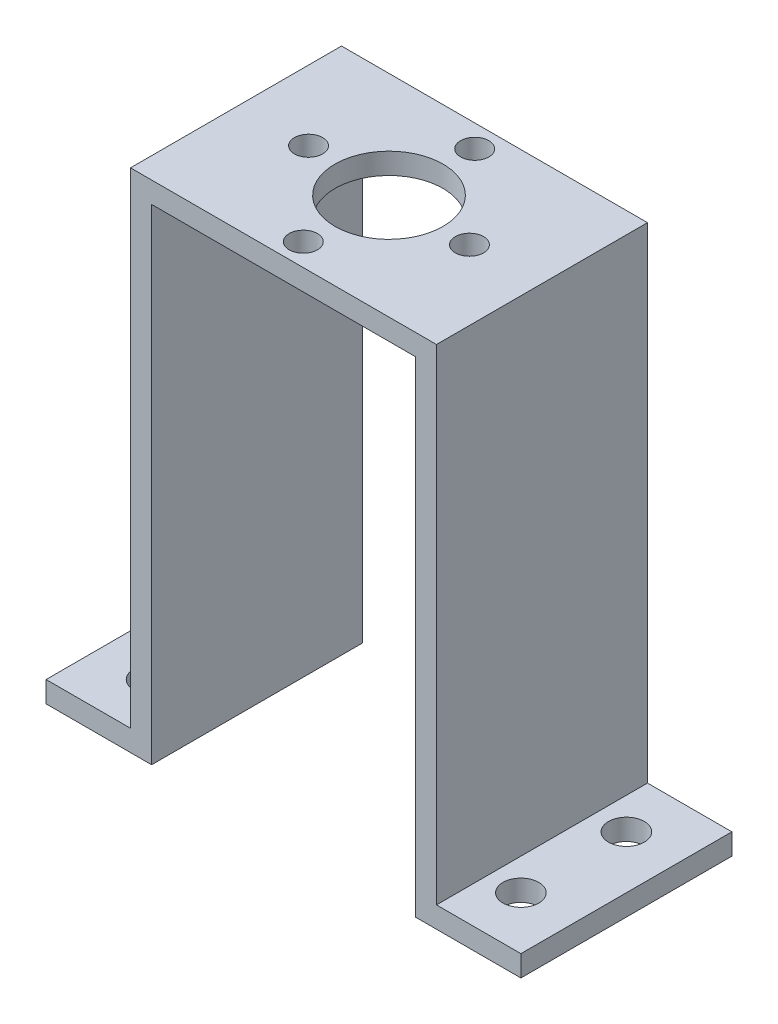
ISO-10303-21;
HEADER;
FILE_DESCRIPTION(('STEP AP214'),'2;1');
FILE_NAME('part.step','',(''),(''),'','','');
FILE_SCHEMA(('AUTOMOTIVE_DESIGN { 1 0 10303 214 1 1 1 1 }'));
ENDSEC;
DATA;
#1=APPLICATION_CONTEXT('core data for automotive mechanical design processes');
#2=APPLICATION_PROTOCOL_DEFINITION('international standard','automotive_design',2000,#1);
#3=PRODUCT_CONTEXT('',#1,'mechanical');
#4=PRODUCT('Part','Part','',(#3));
#5=PRODUCT_RELATED_PRODUCT_CATEGORY('part','',(#4));
#6=PRODUCT_DEFINITION_FORMATION('','',#4);
#7=PRODUCT_DEFINITION_CONTEXT('part definition',#1,'design');
#8=PRODUCT_DEFINITION('design','',#6,#7);
#9=PRODUCT_DEFINITION_SHAPE('','',#8);
#10=(LENGTH_UNIT() NAMED_UNIT(*) SI_UNIT(.MILLI.,.METRE.));
#11=(NAMED_UNIT(*) PLANE_ANGLE_UNIT() SI_UNIT($,.RADIAN.));
#12=(NAMED_UNIT(*) SI_UNIT($,.STERADIAN.) SOLID_ANGLE_UNIT());
#13=UNCERTAINTY_MEASURE_WITH_UNIT(LENGTH_MEASURE(1.E-05),#10,'distance_accuracy_value','');
#14=(GEOMETRIC_REPRESENTATION_CONTEXT(3) GLOBAL_UNCERTAINTY_ASSIGNED_CONTEXT((#13)) GLOBAL_UNIT_ASSIGNED_CONTEXT((#10,
#11,#12)) REPRESENTATION_CONTEXT('',''));
#15=CARTESIAN_POINT('',(0.,0.,0.));
#16=DIRECTION('',(0.,0.,1.));
#17=DIRECTION('',(1.,0.,0.));
#18=AXIS2_PLACEMENT_3D('',#15,#16,#17);
#19=CARTESIAN_POINT('',(40.64,2.54,19.05));
#20=DIRECTION('',(0.,-1.,0.));
#21=DIRECTION('',(0.,0.,-1.));
#22=AXIS2_PLACEMENT_3D('',#19,#20,#21);
#23=CYLINDRICAL_SURFACE('',#22,2.159);
#24=CARTESIAN_POINT('',(40.64,2.54,19.05));
#25=DIRECTION('',(0.,-1.,0.));
#26=DIRECTION('',(0.,0.,-1.));
#27=AXIS2_PLACEMENT_3D('',#24,#25,#26);
#28=CIRCLE('',#27,2.159);
#29=CARTESIAN_POINT('',(40.64,2.54,16.891));
#30=VERTEX_POINT('',#29);
#31=EDGE_CURVE('E158',#30,#30,#28,.T.);
#32=ORIENTED_EDGE('',*,*,#31,.F.);
#33=EDGE_LOOP('',(#32));
#34=FACE_BOUND('',#33,.T.);
#35=CARTESIAN_POINT('',(40.64,0.,19.05));
#36=DIRECTION('',(0.,-1.,0.));
#37=DIRECTION('',(0.,0.,-1.));
#38=AXIS2_PLACEMENT_3D('',#35,#36,#37);
#39=CIRCLE('',#38,2.159);
#40=CARTESIAN_POINT('',(40.64,0.,16.891));
#41=VERTEX_POINT('',#40);
#42=EDGE_CURVE('E19',#41,#41,#39,.F.);
#43=ORIENTED_EDGE('',*,*,#42,.F.);
#44=EDGE_LOOP('',(#43));
#45=FACE_BOUND('',#44,.T.);
#46=ADVANCED_FACE('F16',(#34,#45),#23,.F.);
#47=CARTESIAN_POINT('',(40.64,2.54,6.35));
#48=DIRECTION('',(0.,-1.,0.));
#49=DIRECTION('',(0.,0.,-1.));
#50=AXIS2_PLACEMENT_3D('',#47,#48,#49);
#51=CYLINDRICAL_SURFACE('',#50,2.159);
#52=CARTESIAN_POINT('',(40.64,2.54,6.35));
#53=DIRECTION('',(0.,-1.,0.));
#54=DIRECTION('',(0.,0.,-1.));
#55=AXIS2_PLACEMENT_3D('',#52,#53,#54);
#56=CIRCLE('',#55,2.159);
#57=CARTESIAN_POINT('',(40.64,2.54,4.191));
#58=VERTEX_POINT('',#57);
#59=EDGE_CURVE('E154',#58,#58,#56,.T.);
#60=ORIENTED_EDGE('',*,*,#59,.F.);
#61=EDGE_LOOP('',(#60));
#62=FACE_BOUND('',#61,.T.);
#63=CARTESIAN_POINT('',(40.64,0.,6.35));
#64=DIRECTION('',(0.,-1.,0.));
#65=DIRECTION('',(0.,0.,-1.));
#66=AXIS2_PLACEMENT_3D('',#63,#64,#65);
#67=CIRCLE('',#66,2.159);
#68=CARTESIAN_POINT('',(40.64,0.,4.191));
#69=VERTEX_POINT('',#68);
#70=EDGE_CURVE('E162',#69,#69,#67,.F.);
#71=ORIENTED_EDGE('',*,*,#70,.F.);
#72=EDGE_LOOP('',(#71));
#73=FACE_BOUND('',#72,.T.);
#74=ADVANCED_FACE('F211',(#62,#73),#51,.F.);
#75=CARTESIAN_POINT('',(18.415,60.96,12.7));
#76=DIRECTION('',(0.,1.,0.));
#77=DIRECTION('',(0.,0.,1.));
#78=AXIS2_PLACEMENT_3D('',#75,#76,#77);
#79=CYLINDRICAL_SURFACE('',#78,6.5024);
#80=CARTESIAN_POINT('',(18.415,60.96,12.7));
#81=DIRECTION('',(0.,1.,0.));
#82=DIRECTION('',(0.,0.,1.));
#83=AXIS2_PLACEMENT_3D('',#80,#81,#82);
#84=CIRCLE('',#83,6.5024);
#85=CARTESIAN_POINT('',(18.415,60.96,19.2024));
#86=VERTEX_POINT('',#85);
#87=EDGE_CURVE('E150',#86,#86,#84,.F.);
#88=ORIENTED_EDGE('',*,*,#87,.F.);
#89=EDGE_LOOP('',(#88));
#90=FACE_BOUND('',#89,.T.);
#91=CARTESIAN_POINT('',(18.415,58.42,12.7));
#92=DIRECTION('',(0.,1.,0.));
#93=DIRECTION('',(0.,0.,1.));
#94=AXIS2_PLACEMENT_3D('',#91,#92,#93);
#95=CIRCLE('',#94,6.5024);
#96=CARTESIAN_POINT('',(18.415,58.42,19.2024));
#97=VERTEX_POINT('',#96);
#98=EDGE_CURVE('E115',#97,#97,#95,.T.);
#99=ORIENTED_EDGE('',*,*,#98,.F.);
#100=EDGE_LOOP('',(#99));
#101=FACE_BOUND('',#100,.T.);
#102=ADVANCED_FACE('F217',(#90,#101),#79,.F.);
#103=CARTESIAN_POINT('',(18.7325,60.96,2.6999946));
#104=DIRECTION('',(0.,-1.,0.));
#105=DIRECTION('',(0.,0.,-1.));
#106=AXIS2_PLACEMENT_3D('',#103,#104,#105);
#107=CYLINDRICAL_SURFACE('',#106,1.7018);
#108=CARTESIAN_POINT('',(18.7325,60.96,2.6999946));
#109=DIRECTION('',(0.,-1.,0.));
#110=DIRECTION('',(0.,0.,-1.));
#111=AXIS2_PLACEMENT_3D('',#108,#109,#110);
#112=CIRCLE('',#111,1.7018);
#113=CARTESIAN_POINT('',(18.7325,60.96,0.9981946));
#114=VERTEX_POINT('',#113);
#115=EDGE_CURVE('E193',#114,#114,#112,.T.);
#116=ORIENTED_EDGE('',*,*,#115,.F.);
#117=EDGE_LOOP('',(#116));
#118=FACE_BOUND('',#117,.T.);
#119=CARTESIAN_POINT('',(18.7325,58.42,2.6999946));
#120=DIRECTION('',(0.,-1.,0.));
#121=DIRECTION('',(0.,0.,-1.));
#122=AXIS2_PLACEMENT_3D('',#119,#120,#121);
#123=CIRCLE('',#122,1.7018);
#124=CARTESIAN_POINT('',(18.7325,58.42,0.9981946));
#125=VERTEX_POINT('',#124);
#126=EDGE_CURVE('E176',#125,#125,#123,.F.);
#127=ORIENTED_EDGE('',*,*,#126,.F.);
#128=EDGE_LOOP('',(#127));
#129=FACE_BOUND('',#128,.T.);
#130=ADVANCED_FACE('F292',(#118,#129),#107,.F.);
#131=CARTESIAN_POINT('',(8.4149946,60.96,12.3825));
#132=DIRECTION('',(0.,-1.,0.));
#133=DIRECTION('',(0.,0.,-1.));
#134=AXIS2_PLACEMENT_3D('',#131,#132,#133);
#135=CYLINDRICAL_SURFACE('',#134,1.7018);
#136=CARTESIAN_POINT('',(8.4149946,60.96,12.3825));
#137=DIRECTION('',(0.,-1.,0.));
#138=DIRECTION('',(0.,0.,-1.));
#139=AXIS2_PLACEMENT_3D('',#136,#137,#138);
#140=CIRCLE('',#139,1.7018);
#141=CARTESIAN_POINT('',(8.4149946,60.96,10.6807));
#142=VERTEX_POINT('',#141);
#143=EDGE_CURVE('E190',#142,#142,#140,.T.);
#144=ORIENTED_EDGE('',*,*,#143,.F.);
#145=EDGE_LOOP('',(#144));
#146=FACE_BOUND('',#145,.T.);
#147=CARTESIAN_POINT('',(8.4149946,58.42,12.3825));
#148=DIRECTION('',(0.,-1.,0.));
#149=DIRECTION('',(0.,0.,-1.));
#150=AXIS2_PLACEMENT_3D('',#147,#148,#149);
#151=CIRCLE('',#150,1.7018);
#152=CARTESIAN_POINT('',(8.4149946,58.42,10.6807));
#153=VERTEX_POINT('',#152);
#154=EDGE_CURVE('E173',#153,#153,#151,.F.);
#155=ORIENTED_EDGE('',*,*,#154,.F.);
#156=EDGE_LOOP('',(#155));
#157=FACE_BOUND('',#156,.T.);
#158=ADVANCED_FACE('F288',(#146,#157),#135,.F.);
#159=CARTESIAN_POINT('',(18.0975,60.96,22.7000054));
#160=DIRECTION('',(0.,-1.,0.));
#161=DIRECTION('',(0.,0.,-1.));
#162=AXIS2_PLACEMENT_3D('',#159,#160,#161);
#163=CYLINDRICAL_SURFACE('',#162,1.7018);
#164=CARTESIAN_POINT('',(18.0975,60.96,22.7000054));
#165=DIRECTION('',(0.,-1.,0.));
#166=DIRECTION('',(0.,0.,-1.));
#167=AXIS2_PLACEMENT_3D('',#164,#165,#166);
#168=CIRCLE('',#167,1.7018);
#169=CARTESIAN_POINT('',(18.0975,60.96,20.9982054));
#170=VERTEX_POINT('',#169);
#171=EDGE_CURVE('E187',#170,#170,#168,.T.);
#172=ORIENTED_EDGE('',*,*,#171,.F.);
#173=EDGE_LOOP('',(#172));
#174=FACE_BOUND('',#173,.T.);
#175=CARTESIAN_POINT('',(18.0975,58.42,22.7000054));
#176=DIRECTION('',(0.,-1.,0.));
#177=DIRECTION('',(0.,0.,-1.));
#178=AXIS2_PLACEMENT_3D('',#175,#176,#177);
#179=CIRCLE('',#178,1.7018);
#180=CARTESIAN_POINT('',(18.0975,58.42,20.9982054));
#181=VERTEX_POINT('',#180);
#182=EDGE_CURVE('E132',#181,#181,#179,.F.);
#183=ORIENTED_EDGE('',*,*,#182,.F.);
#184=EDGE_LOOP('',(#183));
#185=FACE_BOUND('',#184,.T.);
#186=ADVANCED_FACE('F284',(#174,#185),#163,.F.);
#187=CARTESIAN_POINT('',(28.4150054,60.96,13.0175));
#188=DIRECTION('',(0.,-1.,0.));
#189=DIRECTION('',(0.,0.,-1.));
#190=AXIS2_PLACEMENT_3D('',#187,#188,#189);
#191=CYLINDRICAL_SURFACE('',#190,1.7018);
#192=CARTESIAN_POINT('',(28.4150054,60.96,13.0175));
#193=DIRECTION('',(0.,-1.,0.));
#194=DIRECTION('',(0.,0.,-1.));
#195=AXIS2_PLACEMENT_3D('',#192,#193,#194);
#196=CIRCLE('',#195,1.7018);
#197=CARTESIAN_POINT('',(28.4150054,60.96,11.3157));
#198=VERTEX_POINT('',#197);
#199=EDGE_CURVE('E146',#198,#198,#196,.T.);
#200=ORIENTED_EDGE('',*,*,#199,.F.);
#201=EDGE_LOOP('',(#200));
#202=FACE_BOUND('',#201,.T.);
#203=CARTESIAN_POINT('',(28.4150054,58.42,13.0175));
#204=DIRECTION('',(0.,-1.,0.));
#205=DIRECTION('',(0.,0.,-1.));
#206=AXIS2_PLACEMENT_3D('',#203,#204,#205);
#207=CIRCLE('',#206,1.7018);
#208=CARTESIAN_POINT('',(28.4150054,58.42,11.3157));
#209=VERTEX_POINT('',#208);
#210=EDGE_CURVE('E129',#209,#209,#207,.F.);
#211=ORIENTED_EDGE('',*,*,#210,.F.);
#212=EDGE_LOOP('',(#211));
#213=FACE_BOUND('',#212,.T.);
#214=ADVANCED_FACE('F280',(#202,#213),#191,.F.);
#215=CARTESIAN_POINT('',(-3.81,2.54,19.05));
#216=DIRECTION('',(0.,-1.,0.));
#217=DIRECTION('',(0.,0.,-1.));
#218=AXIS2_PLACEMENT_3D('',#215,#216,#217);
#219=CYLINDRICAL_SURFACE('',#218,2.159);
#220=CARTESIAN_POINT('',(-3.81,2.54,19.05));
#221=DIRECTION('',(0.,-1.,0.));
#222=DIRECTION('',(0.,0.,-1.));
#223=AXIS2_PLACEMENT_3D('',#220,#221,#222);
#224=CIRCLE('',#223,2.159);
#225=CARTESIAN_POINT('',(-3.81,2.54,16.891));
#226=VERTEX_POINT('',#225);
#227=EDGE_CURVE('E142',#226,#226,#224,.T.);
#228=ORIENTED_EDGE('',*,*,#227,.F.);
#229=EDGE_LOOP('',(#228));
#230=FACE_BOUND('',#229,.T.);
#231=CARTESIAN_POINT('',(-3.81,0.,19.05));
#232=DIRECTION('',(0.,-1.,0.));
#233=DIRECTION('',(0.,0.,-1.));
#234=AXIS2_PLACEMENT_3D('',#231,#232,#233);
#235=CIRCLE('',#234,2.159);
#236=CARTESIAN_POINT('',(-3.81,0.,16.891));
#237=VERTEX_POINT('',#236);
#238=EDGE_CURVE('E167',#237,#237,#235,.F.);
#239=ORIENTED_EDGE('',*,*,#238,.F.);
#240=EDGE_LOOP('',(#239));
#241=FACE_BOUND('',#240,.T.);
#242=ADVANCED_FACE('F276',(#230,#241),#219,.F.);
#243=CARTESIAN_POINT('',(-3.81,2.54,6.35));
#244=DIRECTION('',(0.,-1.,0.));
#245=DIRECTION('',(0.,0.,-1.));
#246=AXIS2_PLACEMENT_3D('',#243,#244,#245);
#247=CYLINDRICAL_SURFACE('',#246,2.159);
#248=CARTESIAN_POINT('',(-3.81,2.54,6.35));
#249=DIRECTION('',(0.,-1.,0.));
#250=DIRECTION('',(0.,0.,-1.));
#251=AXIS2_PLACEMENT_3D('',#248,#249,#250);
#252=CIRCLE('',#251,2.159);
#253=CARTESIAN_POINT('',(-3.81,2.54,4.191));
#254=VERTEX_POINT('',#253);
#255=EDGE_CURVE('E138',#254,#254,#252,.T.);
#256=ORIENTED_EDGE('',*,*,#255,.F.);
#257=EDGE_LOOP('',(#256));
#258=FACE_BOUND('',#257,.T.);
#259=CARTESIAN_POINT('',(-3.81,0.,6.35));
#260=DIRECTION('',(0.,-1.,0.));
#261=DIRECTION('',(0.,0.,-1.));
#262=AXIS2_PLACEMENT_3D('',#259,#260,#261);
#263=CIRCLE('',#262,2.159);
#264=CARTESIAN_POINT('',(-3.81,0.,4.191));
#265=VERTEX_POINT('',#264);
#266=EDGE_CURVE('E164',#265,#265,#263,.F.);
#267=ORIENTED_EDGE('',*,*,#266,.F.);
#268=EDGE_LOOP('',(#267));
#269=FACE_BOUND('',#268,.T.);
#270=ADVANCED_FACE('F273',(#258,#269),#247,.F.);
#271=CARTESIAN_POINT('',(34.29,58.42,0.));
#272=DIRECTION('',(-1.,0.,0.));
#273=DIRECTION('',(0.,0.,1.));
#274=AXIS2_PLACEMENT_3D('',#271,#272,#273);
#275=PLANE('',#274);
#276=DIRECTION('',(0.,0.,-1.));
#277=VECTOR('',#276,1.);
#278=CARTESIAN_POINT('',(34.29,58.42,0.));
#279=LINE('',#278,#277);
#280=CARTESIAN_POINT('',(34.29,58.42,0.));
#281=VERTEX_POINT('',#280);
#282=CARTESIAN_POINT('',(34.29,58.42,25.4));
#283=VERTEX_POINT('',#282);
#284=EDGE_CURVE('E107',#281,#283,#279,.F.);
#285=ORIENTED_EDGE('',*,*,#284,.F.);
#286=DIRECTION('',(0.,1.,0.));
#287=VECTOR('',#286,1.);
#288=CARTESIAN_POINT('',(34.29,0.,0.));
#289=LINE('',#288,#287);
#290=CARTESIAN_POINT('',(34.29,0.,0.));
#291=VERTEX_POINT('',#290);
#292=EDGE_CURVE('E332',#281,#291,#289,.F.);
#293=ORIENTED_EDGE('',*,*,#292,.T.);
#294=DIRECTION('',(0.,0.,-1.));
#295=VECTOR('',#294,1.);
#296=CARTESIAN_POINT('',(34.29,0.,0.));
#297=LINE('',#296,#295);
#298=CARTESIAN_POINT('',(34.29,0.,25.4));
#299=VERTEX_POINT('',#298);
#300=EDGE_CURVE('E102',#299,#291,#297,.T.);
#301=ORIENTED_EDGE('',*,*,#300,.F.);
#302=DIRECTION('',(0.,1.,0.));
#303=VECTOR('',#302,1.);
#304=CARTESIAN_POINT('',(34.29,0.,25.4));
#305=LINE('',#304,#303);
#306=EDGE_CURVE('E119',#283,#299,#305,.F.);
#307=ORIENTED_EDGE('',*,*,#306,.F.);
#308=EDGE_LOOP('',(#285,#293,#301,#307));
#309=FACE_BOUND('',#308,.T.);
#310=ADVANCED_FACE('F120',(#309),#275,.T.);
#311=CARTESIAN_POINT('',(34.29,0.,0.));
#312=DIRECTION('',(0.,-1.,0.));
#313=DIRECTION('',(0.,0.,-1.));
#314=AXIS2_PLACEMENT_3D('',#311,#312,#313);
#315=PLANE('',#314);
#316=ORIENTED_EDGE('',*,*,#70,.T.);
#317=EDGE_LOOP('',(#316));
#318=FACE_BOUND('',#317,.T.);
#319=ORIENTED_EDGE('',*,*,#42,.T.);
#320=EDGE_LOOP('',(#319));
#321=FACE_BOUND('',#320,.T.);
#322=DIRECTION('',(0.,0.,-1.));
#323=VECTOR('',#322,1.);
#324=CARTESIAN_POINT('',(46.99,0.,0.));
#325=LINE('',#324,#323);
#326=CARTESIAN_POINT('',(46.99,0.,25.4));
#327=VERTEX_POINT('',#326);
#328=CARTESIAN_POINT('',(46.99,0.,0.));
#329=VERTEX_POINT('',#328);
#330=EDGE_CURVE('E159',#327,#329,#325,.T.);
#331=ORIENTED_EDGE('',*,*,#330,.F.);
#332=DIRECTION('',(1.,0.,0.));
#333=VECTOR('',#332,1.);
#334=CARTESIAN_POINT('',(0.,0.,25.4));
#335=LINE('',#334,#333);
#336=EDGE_CURVE('E123',#299,#327,#335,.T.);
#337=ORIENTED_EDGE('',*,*,#336,.F.);
#338=ORIENTED_EDGE('',*,*,#300,.T.);
#339=DIRECTION('',(1.,0.,0.));
#340=VECTOR('',#339,1.);
#341=CARTESIAN_POINT('',(0.,0.,0.));
#342=LINE('',#341,#340);
#343=EDGE_CURVE('E330',#291,#329,#342,.T.);
#344=ORIENTED_EDGE('',*,*,#343,.T.);
#345=EDGE_LOOP('',(#331,#337,#338,#344));
#346=FACE_BOUND('',#345,.T.);
#347=ADVANCED_FACE('F207',(#318,#321,#346),#315,.T.);
#348=CARTESIAN_POINT('',(46.99,0.,0.));
#349=DIRECTION('',(1.,0.,0.));
#350=DIRECTION('',(0.,0.,-1.));
#351=AXIS2_PLACEMENT_3D('',#348,#349,#350);
#352=PLANE('',#351);
#353=ORIENTED_EDGE('',*,*,#330,.T.);
#354=DIRECTION('',(0.,1.,0.));
#355=VECTOR('',#354,1.);
#356=CARTESIAN_POINT('',(46.99,0.,0.));
#357=LINE('',#356,#355);
#358=CARTESIAN_POINT('',(46.99,2.54,0.));
#359=VERTEX_POINT('',#358);
#360=EDGE_CURVE('E328',#329,#359,#357,.T.);
#361=ORIENTED_EDGE('',*,*,#360,.T.);
#362=DIRECTION('',(0.,0.,1.));
#363=VECTOR('',#362,1.);
#364=CARTESIAN_POINT('',(46.99,2.54,0.));
#365=LINE('',#364,#363);
#366=CARTESIAN_POINT('',(46.99,2.54,25.4));
#367=VERTEX_POINT('',#366);
#368=EDGE_CURVE('E155',#367,#359,#365,.F.);
#369=ORIENTED_EDGE('',*,*,#368,.F.);
#370=DIRECTION('',(0.,1.,0.));
#371=VECTOR('',#370,1.);
#372=CARTESIAN_POINT('',(46.99,0.,25.4));
#373=LINE('',#372,#371);
#374=EDGE_CURVE('E354',#327,#367,#373,.T.);
#375=ORIENTED_EDGE('',*,*,#374,.F.);
#376=EDGE_LOOP('',(#353,#361,#369,#375));
#377=FACE_BOUND('',#376,.T.);
#378=ADVANCED_FACE('F264',(#377),#352,.T.);
#379=CARTESIAN_POINT('',(46.99,2.54,0.));
#380=DIRECTION('',(0.,1.,0.));
#381=DIRECTION('',(0.,0.,1.));
#382=AXIS2_PLACEMENT_3D('',#379,#380,#381);
#383=PLANE('',#382);
#384=ORIENTED_EDGE('',*,*,#59,.T.);
#385=EDGE_LOOP('',(#384));
#386=FACE_BOUND('',#385,.T.);
#387=ORIENTED_EDGE('',*,*,#31,.T.);
#388=EDGE_LOOP('',(#387));
#389=FACE_BOUND('',#388,.T.);
#390=ORIENTED_EDGE('',*,*,#368,.T.);
#391=DIRECTION('',(1.,0.,0.));
#392=VECTOR('',#391,1.);
#393=CARTESIAN_POINT('',(0.,2.54,0.));
#394=LINE('',#393,#392);
#395=CARTESIAN_POINT('',(36.83,2.54,0.));
#396=VERTEX_POINT('',#395);
#397=EDGE_CURVE('E323',#359,#396,#394,.F.);
#398=ORIENTED_EDGE('',*,*,#397,.T.);
#399=DIRECTION('',(0.,0.,-1.));
#400=VECTOR('',#399,1.);
#401=CARTESIAN_POINT('',(36.83,2.54,0.));
#402=LINE('',#401,#400);
#403=CARTESIAN_POINT('',(36.83,2.54,25.4));
#404=VERTEX_POINT('',#403);
#405=EDGE_CURVE('E151',#404,#396,#402,.T.);
#406=ORIENTED_EDGE('',*,*,#405,.F.);
#407=DIRECTION('',(1.,0.,0.));
#408=VECTOR('',#407,1.);
#409=CARTESIAN_POINT('',(0.,2.54,25.4));
#410=LINE('',#409,#408);
#411=EDGE_CURVE('E351',#367,#404,#410,.F.);
#412=ORIENTED_EDGE('',*,*,#411,.F.);
#413=EDGE_LOOP('',(#390,#398,#406,#412));
#414=FACE_BOUND('',#413,.T.);
#415=ADVANCED_FACE('F260',(#386,#389,#414),#383,.T.);
#416=CARTESIAN_POINT('',(36.83,2.54,0.));
#417=DIRECTION('',(1.,0.,0.));
#418=DIRECTION('',(0.,0.,-1.));
#419=AXIS2_PLACEMENT_3D('',#416,#417,#418);
#420=PLANE('',#419);
#421=ORIENTED_EDGE('',*,*,#405,.T.);
#422=DIRECTION('',(0.,1.,0.));
#423=VECTOR('',#422,1.);
#424=CARTESIAN_POINT('',(36.83,0.,0.));
#425=LINE('',#424,#423);
#426=CARTESIAN_POINT('',(36.83,60.96,0.));
#427=VERTEX_POINT('',#426);
#428=EDGE_CURVE('E318',#396,#427,#425,.T.);
#429=ORIENTED_EDGE('',*,*,#428,.T.);
#430=DIRECTION('',(0.,0.,1.));
#431=VECTOR('',#430,1.);
#432=CARTESIAN_POINT('',(36.83,60.96,0.));
#433=LINE('',#432,#431);
#434=CARTESIAN_POINT('',(36.83,60.96,25.4));
#435=VERTEX_POINT('',#434);
#436=EDGE_CURVE('E147',#435,#427,#433,.F.);
#437=ORIENTED_EDGE('',*,*,#436,.F.);
#438=DIRECTION('',(0.,1.,0.));
#439=VECTOR('',#438,1.);
#440=CARTESIAN_POINT('',(36.83,0.,25.4));
#441=LINE('',#440,#439);
#442=EDGE_CURVE('E349',#404,#435,#441,.T.);
#443=ORIENTED_EDGE('',*,*,#442,.F.);
#444=EDGE_LOOP('',(#421,#429,#437,#443));
#445=FACE_BOUND('',#444,.T.);
#446=ADVANCED_FACE('F256',(#445),#420,.T.);
#447=CARTESIAN_POINT('',(36.83,60.96,0.));
#448=DIRECTION('',(0.,1.,0.));
#449=DIRECTION('',(0.,0.,1.));
#450=AXIS2_PLACEMENT_3D('',#447,#448,#449);
#451=PLANE('',#450);
#452=ORIENTED_EDGE('',*,*,#199,.T.);
#453=EDGE_LOOP('',(#452));
#454=FACE_BOUND('',#453,.T.);
#455=ORIENTED_EDGE('',*,*,#171,.T.);
#456=EDGE_LOOP('',(#455));
#457=FACE_BOUND('',#456,.T.);
#458=ORIENTED_EDGE('',*,*,#143,.T.);
#459=EDGE_LOOP('',(#458));
#460=FACE_BOUND('',#459,.T.);
#461=ORIENTED_EDGE('',*,*,#115,.T.);
#462=EDGE_LOOP('',(#461));
#463=FACE_BOUND('',#462,.T.);
#464=ORIENTED_EDGE('',*,*,#87,.T.);
#465=EDGE_LOOP('',(#464));
#466=FACE_BOUND('',#465,.T.);
#467=ORIENTED_EDGE('',*,*,#436,.T.);
#468=DIRECTION('',(1.,0.,0.));
#469=VECTOR('',#468,1.);
#470=CARTESIAN_POINT('',(0.,60.96,0.));
#471=LINE('',#470,#469);
#472=CARTESIAN_POINT('',(0.,60.96,0.));
#473=VERTEX_POINT('',#472);
#474=EDGE_CURVE('E309',#427,#473,#471,.F.);
#475=ORIENTED_EDGE('',*,*,#474,.T.);
#476=DIRECTION('',(0.,0.,1.));
#477=VECTOR('',#476,1.);
#478=CARTESIAN_POINT('',(0.,60.96,0.));
#479=LINE('',#478,#477);
#480=CARTESIAN_POINT('',(0.,60.96,25.4));
#481=VERTEX_POINT('',#480);
#482=EDGE_CURVE('E143',#481,#473,#479,.F.);
#483=ORIENTED_EDGE('',*,*,#482,.F.);
#484=DIRECTION('',(1.,0.,0.));
#485=VECTOR('',#484,1.);
#486=CARTESIAN_POINT('',(0.,60.96,25.4));
#487=LINE('',#486,#485);
#488=EDGE_CURVE('E311',#435,#481,#487,.F.);
#489=ORIENTED_EDGE('',*,*,#488,.F.);
#490=EDGE_LOOP('',(#467,#475,#483,#489));
#491=FACE_BOUND('',#490,.T.);
#492=ADVANCED_FACE('F252',(#454,#457,#460,#463,#466,#491),#451,.T.);
#493=CARTESIAN_POINT('',(0.,60.96,0.));
#494=DIRECTION('',(-1.,0.,0.));
#495=DIRECTION('',(0.,0.,1.));
#496=AXIS2_PLACEMENT_3D('',#493,#494,#495);
#497=PLANE('',#496);
#498=ORIENTED_EDGE('',*,*,#482,.T.);
#499=DIRECTION('',(0.,1.,0.));
#500=VECTOR('',#499,1.);
#501=CARTESIAN_POINT('',(0.,0.,0.));
#502=LINE('',#501,#500);
#503=CARTESIAN_POINT('',(0.,2.54,0.));
#504=VERTEX_POINT('',#503);
#505=EDGE_CURVE('E319',#473,#504,#502,.F.);
#506=ORIENTED_EDGE('',*,*,#505,.T.);
#507=DIRECTION('',(0.,0.,1.));
#508=VECTOR('',#507,1.);
#509=CARTESIAN_POINT('',(0.,2.54,0.));
#510=LINE('',#509,#508);
#511=CARTESIAN_POINT('',(0.,2.54,25.4));
#512=VERTEX_POINT('',#511);
#513=EDGE_CURVE('E139',#512,#504,#510,.F.);
#514=ORIENTED_EDGE('',*,*,#513,.F.);
#515=DIRECTION('',(0.,1.,0.));
#516=VECTOR('',#515,1.);
#517=CARTESIAN_POINT('',(0.,0.,25.4));
#518=LINE('',#517,#516);
#519=EDGE_CURVE('E345',#481,#512,#518,.F.);
#520=ORIENTED_EDGE('',*,*,#519,.F.);
#521=EDGE_LOOP('',(#498,#506,#514,#520));
#522=FACE_BOUND('',#521,.T.);
#523=ADVANCED_FACE('F248',(#522),#497,.T.);
#524=CARTESIAN_POINT('',(0.,2.54,0.));
#525=DIRECTION('',(0.,1.,0.));
#526=DIRECTION('',(0.,0.,1.));
#527=AXIS2_PLACEMENT_3D('',#524,#525,#526);
#528=PLANE('',#527);
#529=ORIENTED_EDGE('',*,*,#255,.T.);
#530=EDGE_LOOP('',(#529));
#531=FACE_BOUND('',#530,.T.);
#532=ORIENTED_EDGE('',*,*,#227,.T.);
#533=EDGE_LOOP('',(#532));
#534=FACE_BOUND('',#533,.T.);
#535=ORIENTED_EDGE('',*,*,#513,.T.);
#536=DIRECTION('',(1.,0.,0.));
#537=VECTOR('',#536,1.);
#538=CARTESIAN_POINT('',(0.,2.54,0.));
#539=LINE('',#538,#537);
#540=CARTESIAN_POINT('',(-10.16,2.54,0.));
#541=VERTEX_POINT('',#540);
#542=EDGE_CURVE('E321',#504,#541,#539,.F.);
#543=ORIENTED_EDGE('',*,*,#542,.T.);
#544=DIRECTION('',(0.,0.,1.));
#545=VECTOR('',#544,1.);
#546=CARTESIAN_POINT('',(-10.16,2.54,0.));
#547=LINE('',#546,#545);
#548=CARTESIAN_POINT('',(-10.16,2.54,25.4));
#549=VERTEX_POINT('',#548);
#550=EDGE_CURVE('E116',#549,#541,#547,.F.);
#551=ORIENTED_EDGE('',*,*,#550,.F.);
#552=DIRECTION('',(1.,0.,0.));
#553=VECTOR('',#552,1.);
#554=CARTESIAN_POINT('',(0.,2.54,25.4));
#555=LINE('',#554,#553);
#556=EDGE_CURVE('E342',#512,#549,#555,.F.);
#557=ORIENTED_EDGE('',*,*,#556,.F.);
#558=EDGE_LOOP('',(#535,#543,#551,#557));
#559=FACE_BOUND('',#558,.T.);
#560=ADVANCED_FACE('F244',(#531,#534,#559),#528,.T.);
#561=CARTESIAN_POINT('',(-10.16,2.54,0.));
#562=DIRECTION('',(-1.,0.,0.));
#563=DIRECTION('',(0.,0.,1.));
#564=AXIS2_PLACEMENT_3D('',#561,#562,#563);
#565=PLANE('',#564);
#566=ORIENTED_EDGE('',*,*,#550,.T.);
#567=DIRECTION('',(0.,1.,0.));
#568=VECTOR('',#567,1.);
#569=CARTESIAN_POINT('',(-10.16,0.,0.));
#570=LINE('',#569,#568);
#571=CARTESIAN_POINT('',(-10.16,0.,0.));
#572=VERTEX_POINT('',#571);
#573=EDGE_CURVE('E371',#541,#572,#570,.F.);
#574=ORIENTED_EDGE('',*,*,#573,.T.);
#575=DIRECTION('',(0.,0.,-1.));
#576=VECTOR('',#575,1.);
#577=CARTESIAN_POINT('',(-10.16,0.,0.));
#578=LINE('',#577,#576);
#579=CARTESIAN_POINT('',(-10.16,0.,25.4));
#580=VERTEX_POINT('',#579);
#581=EDGE_CURVE('E169',#580,#572,#578,.T.);
#582=ORIENTED_EDGE('',*,*,#581,.F.);
#583=DIRECTION('',(0.,1.,0.));
#584=VECTOR('',#583,1.);
#585=CARTESIAN_POINT('',(-10.16,0.,25.4));
#586=LINE('',#585,#584);
#587=EDGE_CURVE('E340',#549,#580,#586,.F.);
#588=ORIENTED_EDGE('',*,*,#587,.F.);
#589=EDGE_LOOP('',(#566,#574,#582,#588));
#590=FACE_BOUND('',#589,.T.);
#591=ADVANCED_FACE('F240',(#590),#565,.T.);
#592=CARTESIAN_POINT('',(2.54,58.42,0.));
#593=DIRECTION('',(0.,-1.,0.));
#594=DIRECTION('',(0.,0.,-1.));
#595=AXIS2_PLACEMENT_3D('',#592,#593,#594);
#596=PLANE('',#595);
#597=ORIENTED_EDGE('',*,*,#210,.T.);
#598=EDGE_LOOP('',(#597));
#599=FACE_BOUND('',#598,.T.);
#600=ORIENTED_EDGE('',*,*,#182,.T.);
#601=EDGE_LOOP('',(#600));
#602=FACE_BOUND('',#601,.T.);
#603=ORIENTED_EDGE('',*,*,#154,.T.);
#604=EDGE_LOOP('',(#603));
#605=FACE_BOUND('',#604,.T.);
#606=ORIENTED_EDGE('',*,*,#126,.T.);
#607=EDGE_LOOP('',(#606));
#608=FACE_BOUND('',#607,.T.);
#609=ORIENTED_EDGE('',*,*,#98,.T.);
#610=EDGE_LOOP('',(#609));
#611=FACE_BOUND('',#610,.T.);
#612=DIRECTION('',(0.,0.,-1.));
#613=VECTOR('',#612,1.);
#614=CARTESIAN_POINT('',(2.54,58.42,0.));
#615=LINE('',#614,#613);
#616=CARTESIAN_POINT('',(2.54,58.42,0.));
#617=VERTEX_POINT('',#616);
#618=CARTESIAN_POINT('',(2.54,58.42,25.4));
#619=VERTEX_POINT('',#618);
#620=EDGE_CURVE('E369',#617,#619,#615,.F.);
#621=ORIENTED_EDGE('',*,*,#620,.F.);
#622=DIRECTION('',(1.,0.,0.));
#623=VECTOR('',#622,1.);
#624=CARTESIAN_POINT('',(0.,58.42,0.));
#625=LINE('',#624,#623);
#626=EDGE_CURVE('E113',#617,#281,#625,.T.);
#627=ORIENTED_EDGE('',*,*,#626,.T.);
#628=ORIENTED_EDGE('',*,*,#284,.T.);
#629=DIRECTION('',(1.,0.,0.));
#630=VECTOR('',#629,1.);
#631=CARTESIAN_POINT('',(0.,58.42,25.4));
#632=LINE('',#631,#630);
#633=EDGE_CURVE('E110',#619,#283,#632,.T.);
#634=ORIENTED_EDGE('',*,*,#633,.F.);
#635=EDGE_LOOP('',(#621,#627,#628,#634));
#636=FACE_BOUND('',#635,.T.);
#637=ADVANCED_FACE('F108',(#599,#602,#605,#608,#611,#636),#596,.T.);
#638=CARTESIAN_POINT('',(0.,0.,25.4));
#639=DIRECTION('',(0.,0.,1.));
#640=DIRECTION('',(1.,0.,0.));
#641=AXIS2_PLACEMENT_3D('',#638,#639,#640);
#642=PLANE('',#641);
#643=ORIENTED_EDGE('',*,*,#587,.T.);
#644=DIRECTION('',(1.,0.,0.));
#645=VECTOR('',#644,1.);
#646=CARTESIAN_POINT('',(0.,0.,25.4));
#647=LINE('',#646,#645);
#648=CARTESIAN_POINT('',(2.54,0.,25.4));
#649=VERTEX_POINT('',#648);
#650=EDGE_CURVE('E337',#649,#580,#647,.F.);
#651=ORIENTED_EDGE('',*,*,#650,.F.);
#652=DIRECTION('',(0.,1.,0.));
#653=VECTOR('',#652,1.);
#654=CARTESIAN_POINT('',(2.54,0.,25.4));
#655=LINE('',#654,#653);
#656=EDGE_CURVE('E127',#619,#649,#655,.F.);
#657=ORIENTED_EDGE('',*,*,#656,.F.);
#658=ORIENTED_EDGE('',*,*,#633,.T.);
#659=ORIENTED_EDGE('',*,*,#306,.T.);
#660=ORIENTED_EDGE('',*,*,#336,.T.);
#661=ORIENTED_EDGE('',*,*,#374,.T.);
#662=ORIENTED_EDGE('',*,*,#411,.T.);
#663=ORIENTED_EDGE('',*,*,#442,.T.);
#664=ORIENTED_EDGE('',*,*,#488,.T.);
#665=ORIENTED_EDGE('',*,*,#519,.T.);
#666=ORIENTED_EDGE('',*,*,#556,.T.);
#667=EDGE_LOOP('',(#643,#651,#657,#658,#659,#660,#661,#662,#663,#664,#665,#666));
#668=FACE_BOUND('',#667,.T.);
#669=ADVANCED_FACE('F125',(#668),#642,.T.);
#670=CARTESIAN_POINT('',(0.,0.,0.));
#671=DIRECTION('',(0.,-1.,0.));
#672=DIRECTION('',(0.,0.,-1.));
#673=AXIS2_PLACEMENT_3D('',#670,#671,#672);
#674=PLANE('',#673);
#675=ORIENTED_EDGE('',*,*,#266,.T.);
#676=EDGE_LOOP('',(#675));
#677=FACE_BOUND('',#676,.T.);
#678=ORIENTED_EDGE('',*,*,#238,.T.);
#679=EDGE_LOOP('',(#678));
#680=FACE_BOUND('',#679,.T.);
#681=ORIENTED_EDGE('',*,*,#581,.T.);
#682=DIRECTION('',(1.,0.,0.));
#683=VECTOR('',#682,1.);
#684=CARTESIAN_POINT('',(0.,0.,0.));
#685=LINE('',#684,#683);
#686=CARTESIAN_POINT('',(2.54,0.,0.));
#687=VERTEX_POINT('',#686);
#688=EDGE_CURVE('E34',#572,#687,#685,.T.);
#689=ORIENTED_EDGE('',*,*,#688,.T.);
#690=DIRECTION('',(0.,0.,-1.));
#691=VECTOR('',#690,1.);
#692=CARTESIAN_POINT('',(2.54,0.,0.));
#693=LINE('',#692,#691);
#694=EDGE_CURVE('E25',#649,#687,#693,.T.);
#695=ORIENTED_EDGE('',*,*,#694,.F.);
#696=ORIENTED_EDGE('',*,*,#650,.T.);
#697=EDGE_LOOP('',(#681,#689,#695,#696));
#698=FACE_BOUND('',#697,.T.);
#699=ADVANCED_FACE('F228',(#677,#680,#698),#674,.T.);
#700=CARTESIAN_POINT('',(0.,0.,0.));
#701=DIRECTION('',(0.,0.,1.));
#702=DIRECTION('',(1.,0.,0.));
#703=AXIS2_PLACEMENT_3D('',#700,#701,#702);
#704=PLANE('',#703);
#705=ORIENTED_EDGE('',*,*,#542,.F.);
#706=ORIENTED_EDGE('',*,*,#505,.F.);
#707=ORIENTED_EDGE('',*,*,#474,.F.);
#708=ORIENTED_EDGE('',*,*,#428,.F.);
#709=ORIENTED_EDGE('',*,*,#397,.F.);
#710=ORIENTED_EDGE('',*,*,#360,.F.);
#711=ORIENTED_EDGE('',*,*,#343,.F.);
#712=ORIENTED_EDGE('',*,*,#292,.F.);
#713=ORIENTED_EDGE('',*,*,#626,.F.);
#714=DIRECTION('',(0.,1.,0.));
#715=VECTOR('',#714,1.);
#716=CARTESIAN_POINT('',(2.54,0.,0.));
#717=LINE('',#716,#715);
#718=EDGE_CURVE('E11',#687,#617,#717,.T.);
#719=ORIENTED_EDGE('',*,*,#718,.F.);
#720=ORIENTED_EDGE('',*,*,#688,.F.);
#721=ORIENTED_EDGE('',*,*,#573,.F.);
#722=EDGE_LOOP('',(#705,#706,#707,#708,#709,#710,#711,#712,#713,#719,#720,#721));
#723=FACE_BOUND('',#722,.T.);
#724=ADVANCED_FACE('F222',(#723),#704,.F.);
#725=CARTESIAN_POINT('',(2.54,0.,0.));
#726=DIRECTION('',(1.,0.,0.));
#727=DIRECTION('',(0.,0.,-1.));
#728=AXIS2_PLACEMENT_3D('',#725,#726,#727);
#729=PLANE('',#728);
#730=ORIENTED_EDGE('',*,*,#694,.T.);
#731=ORIENTED_EDGE('',*,*,#718,.T.);
#732=ORIENTED_EDGE('',*,*,#620,.T.);
#733=ORIENTED_EDGE('',*,*,#656,.T.);
#734=EDGE_LOOP('',(#730,#731,#732,#733));
#735=FACE_BOUND('',#734,.T.);
#736=ADVANCED_FACE('F220',(#735),#729,.T.);
#737=CLOSED_SHELL('',(#46,#74,#102,#130,#158,#186,#214,#242,#270,#310,#347,#378,#415,#446,#492,
#523,#560,#591,#637,#669,#699,#724,#736));
#738=MANIFOLD_SOLID_BREP('B1',#737);
#739=ADVANCED_BREP_SHAPE_REPRESENTATION('',(#18,#738),#14);
#740=SHAPE_DEFINITION_REPRESENTATION(#9,#739);
ENDSEC;
END-ISO-10303-21;
